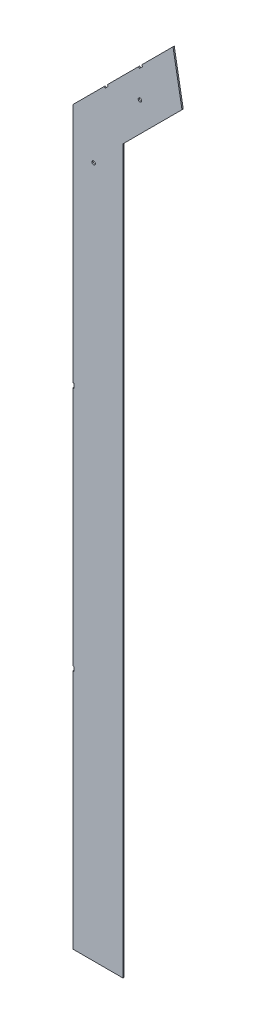
ISO-10303-21;
HEADER;
FILE_DESCRIPTION(('STEP AP214'),'2;1');
FILE_NAME('part.step','',(''),(''),'','','');
FILE_SCHEMA(('AUTOMOTIVE_DESIGN { 1 0 10303 214 1 1 1 1 }'));
ENDSEC;
DATA;
#1=APPLICATION_CONTEXT('core data for automotive mechanical design processes');
#2=APPLICATION_PROTOCOL_DEFINITION('international standard','automotive_design',2000,#1);
#3=PRODUCT_CONTEXT('',#1,'mechanical');
#4=PRODUCT('Part','Part','',(#3));
#5=PRODUCT_RELATED_PRODUCT_CATEGORY('part','',(#4));
#6=PRODUCT_DEFINITION_FORMATION('','',#4);
#7=PRODUCT_DEFINITION_CONTEXT('part definition',#1,'design');
#8=PRODUCT_DEFINITION('design','',#6,#7);
#9=PRODUCT_DEFINITION_SHAPE('','',#8);
#10=(LENGTH_UNIT() NAMED_UNIT(*) SI_UNIT(.MILLI.,.METRE.));
#11=(NAMED_UNIT(*) PLANE_ANGLE_UNIT() SI_UNIT($,.RADIAN.));
#12=(NAMED_UNIT(*) SI_UNIT($,.STERADIAN.) SOLID_ANGLE_UNIT());
#13=UNCERTAINTY_MEASURE_WITH_UNIT(LENGTH_MEASURE(1.E-05),#10,'distance_accuracy_value','');
#14=(GEOMETRIC_REPRESENTATION_CONTEXT(3) GLOBAL_UNCERTAINTY_ASSIGNED_CONTEXT((#13)) GLOBAL_UNIT_ASSIGNED_CONTEXT((#10,
#11,#12)) REPRESENTATION_CONTEXT('',''));
#15=CARTESIAN_POINT('',(0.,0.,0.));
#16=DIRECTION('',(0.,0.,1.));
#17=DIRECTION('',(1.,0.,0.));
#18=AXIS2_PLACEMENT_3D('',#15,#16,#17);
#19=CARTESIAN_POINT('',(0.,0.,0.));
#20=DIRECTION('',(0.,0.,1.));
#21=DIRECTION('',(1.,0.,0.));
#22=AXIS2_PLACEMENT_3D('',#19,#20,#21);
#23=PLANE('',#22);
#24=CARTESIAN_POINT('',(-559.25,332.,0.));
#25=DIRECTION('',(0.,0.,-1.));
#26=DIRECTION('',(-1.,0.,0.));
#27=AXIS2_PLACEMENT_3D('',#24,#25,#26);
#28=CIRCLE('',#27,2.09999999999999);
#29=CARTESIAN_POINT('',(-561.35,332.,0.));
#30=VERTEX_POINT('',#29);
#31=EDGE_CURVE('E337',#30,#30,#28,.T.);
#32=ORIENTED_EDGE('',*,*,#31,.F.);
#33=EDGE_LOOP('',(#32));
#34=FACE_BOUND('',#33,.T.);
#35=CARTESIAN_POINT('',(-503.894660940672,425.000000000001,0.));
#36=DIRECTION('',(0.,0.,-1.));
#37=DIRECTION('',(-1.,0.,0.));
#38=AXIS2_PLACEMENT_3D('',#35,#36,#37);
#39=CIRCLE('',#38,2.09999999999999);
#40=CARTESIAN_POINT('',(-505.994660940672,425.000000000001,0.));
#41=VERTEX_POINT('',#40);
#42=EDGE_CURVE('E441',#41,#41,#39,.T.);
#43=ORIENTED_EDGE('',*,*,#42,.F.);
#44=EDGE_LOOP('',(#43));
#45=FACE_BOUND('',#44,.T.);
#46=DIRECTION('',(0.707106781186546,-0.707106781186549,0.));
#47=VECTOR('',#46,1.);
#48=CARTESIAN_POINT('',(-546.88986531643,417.642977396045,0.));
#49=LINE('',#48,#47);
#50=CARTESIAN_POINT('',(-546.748443960193,417.501556039808,0.));
#51=VERTEX_POINT('',#50);
#52=CARTESIAN_POINT('',(-545.546362432176,416.299474511791,0.));
#53=VERTEX_POINT('',#52);
#54=EDGE_CURVE('E259',#51,#53,#49,.T.);
#55=ORIENTED_EDGE('',*,*,#54,.T.);
#56=DIRECTION('',(-0.707106781186553,-0.707106781186542,0.));
#57=VECTOR('',#56,1.);
#58=CARTESIAN_POINT('',(-545.546362432176,416.299474511791,0.));
#59=LINE('',#58,#57);
#60=CARTESIAN_POINT('',(-541.727985813768,420.117851130198,0.));
#61=VERTEX_POINT('',#60);
#62=EDGE_CURVE('E248',#61,#53,#59,.T.);
#63=ORIENTED_EDGE('',*,*,#62,.F.);
#64=DIRECTION('',(0.707106781186546,-0.707106781186549,0.));
#65=VECTOR('',#64,1.);
#66=CARTESIAN_POINT('',(-543.071488698023,421.461354014453,0.));
#67=LINE('',#66,#65);
#68=CARTESIAN_POINT('',(-542.930067341785,421.319932658215,0.));
#69=VERTEX_POINT('',#68);
#70=EDGE_CURVE('E261',#69,#61,#67,.T.);
#71=ORIENTED_EDGE('',*,*,#70,.F.);
#72=DIRECTION('',(0.707106781186549,0.707106781186546,0.));
#73=VECTOR('',#72,1.);
#74=CARTESIAN_POINT('',(-584.25,380.,0.));
#75=LINE('',#74,#73);
#76=CARTESIAN_POINT('',(-505.569932658215,458.680067341785,0.));
#77=VERTEX_POINT('',#76);
#78=EDGE_CURVE('E347',#69,#77,#75,.T.);
#79=ORIENTED_EDGE('',*,*,#78,.T.);
#80=DIRECTION('',(0.707106781186546,-0.707106781186549,0.));
#81=VECTOR('',#80,1.);
#82=CARTESIAN_POINT('',(-505.711354014452,458.821488698023,0.));
#83=LINE('',#82,#81);
#84=CARTESIAN_POINT('',(-504.367851130198,457.477985813768,0.));
#85=VERTEX_POINT('',#84);
#86=EDGE_CURVE('E276',#77,#85,#83,.T.);
#87=ORIENTED_EDGE('',*,*,#86,.T.);
#88=DIRECTION('',(-0.707106781186548,-0.707106781186548,0.));
#89=VECTOR('',#88,1.);
#90=CARTESIAN_POINT('',(-504.367851130198,457.477985813768,0.));
#91=LINE('',#90,#89);
#92=CARTESIAN_POINT('',(-500.549474511791,461.296362432176,0.));
#93=VERTEX_POINT('',#92);
#94=EDGE_CURVE('E273',#93,#85,#91,.T.);
#95=ORIENTED_EDGE('',*,*,#94,.F.);
#96=DIRECTION('',(0.707106781186546,-0.707106781186549,0.));
#97=VECTOR('',#96,1.);
#98=CARTESIAN_POINT('',(-501.892977396045,462.63986531643,0.));
#99=LINE('',#98,#97);
#100=CARTESIAN_POINT('',(-501.751556039808,462.498443960193,0.));
#101=VERTEX_POINT('',#100);
#102=EDGE_CURVE('E279',#101,#93,#99,.T.);
#103=ORIENTED_EDGE('',*,*,#102,.F.);
#104=CARTESIAN_POINT('',(-464.25,500.,0.));
#105=VERTEX_POINT('',#104);
#106=EDGE_CURVE('E325',#101,#105,#75,.T.);
#107=ORIENTED_EDGE('',*,*,#106,.T.);
#108=DIRECTION('',(0.17573327643003,-0.984437817007843,0.));
#109=VECTOR('',#108,1.);
#110=CARTESIAN_POINT('',(-363.413704359279,-64.8734535216678,0.));
#111=LINE('',#110,#109);
#112=CARTESIAN_POINT('',(-453.539321881346,440.,0.));
#113=VERTEX_POINT('',#112);
#114=EDGE_CURVE('E331',#105,#113,#111,.T.);
#115=ORIENTED_EDGE('',*,*,#114,.T.);
#116=DIRECTION('',(0.707106781186547,0.707106781186547,0.));
#117=VECTOR('',#116,1.);
#118=CARTESIAN_POINT('',(-524.25,369.289321881346,0.));
#119=LINE('',#118,#117);
#120=CARTESIAN_POINT('',(-524.25,369.289321881346,0.));
#121=VERTEX_POINT('',#120);
#122=EDGE_CURVE('E435',#121,#113,#119,.T.);
#123=ORIENTED_EDGE('',*,*,#122,.F.);
#124=DIRECTION('',(0.,1.,0.));
#125=VECTOR('',#124,1.);
#126=CARTESIAN_POINT('',(-524.25,0.,0.));
#127=LINE('',#126,#125);
#128=CARTESIAN_POINT('',(-524.25,-495.5,0.));
#129=VERTEX_POINT('',#128);
#130=EDGE_CURVE('E436',#129,#121,#127,.T.);
#131=ORIENTED_EDGE('',*,*,#130,.F.);
#132=DIRECTION('',(-1.,0.,0.));
#133=VECTOR('',#132,1.);
#134=CARTESIAN_POINT('',(0.,-495.5,0.));
#135=LINE('',#134,#133);
#136=CARTESIAN_POINT('',(-584.25,-495.5,0.));
#137=VERTEX_POINT('',#136);
#138=EDGE_CURVE('E323',#129,#137,#135,.T.);
#139=ORIENTED_EDGE('',*,*,#138,.T.);
#140=DIRECTION('',(0.,1.,0.));
#141=VECTOR('',#140,1.);
#142=CARTESIAN_POINT('',(-584.25,500.,0.));
#143=LINE('',#142,#141);
#144=CARTESIAN_POINT('',(-584.25,-207.2,0.));
#145=VERTEX_POINT('',#144);
#146=EDGE_CURVE('E327',#137,#145,#143,.T.);
#147=ORIENTED_EDGE('',*,*,#146,.T.);
#148=DIRECTION('',(1.,0.,0.));
#149=VECTOR('',#148,1.);
#150=CARTESIAN_POINT('',(-584.45,-207.2,0.));
#151=LINE('',#150,#149);
#152=CARTESIAN_POINT('',(-582.55,-207.2,0.));
#153=VERTEX_POINT('',#152);
#154=EDGE_CURVE('E295',#145,#153,#151,.T.);
#155=ORIENTED_EDGE('',*,*,#154,.T.);
#156=DIRECTION('',(0.,-1.,0.));
#157=VECTOR('',#156,1.);
#158=CARTESIAN_POINT('',(-582.55,-207.2,0.));
#159=LINE('',#158,#157);
#160=CARTESIAN_POINT('',(-582.55,-201.8,0.));
#161=VERTEX_POINT('',#160);
#162=EDGE_CURVE('E292',#161,#153,#159,.T.);
#163=ORIENTED_EDGE('',*,*,#162,.F.);
#164=DIRECTION('',(1.,0.,0.));
#165=VECTOR('',#164,1.);
#166=CARTESIAN_POINT('',(-584.45,-201.8,0.));
#167=LINE('',#166,#165);
#168=CARTESIAN_POINT('',(-584.25,-201.8,0.));
#169=VERTEX_POINT('',#168);
#170=EDGE_CURVE('E298',#169,#161,#167,.T.);
#171=ORIENTED_EDGE('',*,*,#170,.F.);
#172=CARTESIAN_POINT('',(-584.25,86.3000000000004,0.));
#173=VERTEX_POINT('',#172);
#174=EDGE_CURVE('E332',#169,#173,#143,.T.);
#175=ORIENTED_EDGE('',*,*,#174,.T.);
#176=DIRECTION('',(1.,0.,0.));
#177=VECTOR('',#176,1.);
#178=CARTESIAN_POINT('',(-584.45,86.3000000000004,0.));
#179=LINE('',#178,#177);
#180=CARTESIAN_POINT('',(-582.55,86.3000000000004,0.));
#181=VERTEX_POINT('',#180);
#182=EDGE_CURVE('E311',#173,#181,#179,.T.);
#183=ORIENTED_EDGE('',*,*,#182,.T.);
#184=DIRECTION('',(0.,-1.,0.));
#185=VECTOR('',#184,1.);
#186=CARTESIAN_POINT('',(-582.55,86.3000000000004,0.));
#187=LINE('',#186,#185);
#188=CARTESIAN_POINT('',(-582.55,91.7000000000004,0.));
#189=VERTEX_POINT('',#188);
#190=EDGE_CURVE('E308',#189,#181,#187,.T.);
#191=ORIENTED_EDGE('',*,*,#190,.F.);
#192=DIRECTION('',(1.,0.,0.));
#193=VECTOR('',#192,1.);
#194=CARTESIAN_POINT('',(-584.45,91.7000000000004,0.));
#195=LINE('',#194,#193);
#196=CARTESIAN_POINT('',(-584.25,91.7000000000004,0.));
#197=VERTEX_POINT('',#196);
#198=EDGE_CURVE('E286',#197,#189,#195,.T.);
#199=ORIENTED_EDGE('',*,*,#198,.F.);
#200=CARTESIAN_POINT('',(-584.25,380.,0.));
#201=VERTEX_POINT('',#200);
#202=EDGE_CURVE('E334',#197,#201,#143,.T.);
#203=ORIENTED_EDGE('',*,*,#202,.T.);
#204=EDGE_CURVE('E350',#201,#51,#75,.T.);
#205=ORIENTED_EDGE('',*,*,#204,.T.);
#206=EDGE_LOOP('',(#55,#63,#71,#79,#87,#95,#103,#107,#115,#123,#131,#139,#147,#155,#163,#171,
#175,#183,#191,#199,#203,#205));
#207=FACE_BOUND('',#206,.T.);
#208=ADVANCED_FACE('F42',(#34,#45,#207),#23,.F.);
#209=CARTESIAN_POINT('',(265.75,440.,1.5));
#210=DIRECTION('',(0.,0.,1.));
#211=DIRECTION('',(1.,0.,0.));
#212=AXIS2_PLACEMENT_3D('',#209,#210,#211);
#213=PLANE('',#212);
#214=CARTESIAN_POINT('',(-559.25,332.,1.5));
#215=DIRECTION('',(0.,0.,-1.));
#216=DIRECTION('',(-1.,0.,0.));
#217=AXIS2_PLACEMENT_3D('',#214,#215,#216);
#218=CIRCLE('',#217,2.09999999999999);
#219=CARTESIAN_POINT('',(-561.35,332.,1.5));
#220=VERTEX_POINT('',#219);
#221=EDGE_CURVE('E452',#220,#220,#218,.T.);
#222=ORIENTED_EDGE('',*,*,#221,.T.);
#223=EDGE_LOOP('',(#222));
#224=FACE_BOUND('',#223,.T.);
#225=CARTESIAN_POINT('',(-503.894660940672,425.000000000001,1.5));
#226=DIRECTION('',(0.,0.,-1.));
#227=DIRECTION('',(-1.,0.,0.));
#228=AXIS2_PLACEMENT_3D('',#225,#226,#227);
#229=CIRCLE('',#228,2.09999999999999);
#230=CARTESIAN_POINT('',(-505.994660940672,425.000000000001,1.5));
#231=VERTEX_POINT('',#230);
#232=EDGE_CURVE('E383',#231,#231,#229,.T.);
#233=ORIENTED_EDGE('',*,*,#232,.T.);
#234=EDGE_LOOP('',(#233));
#235=FACE_BOUND('',#234,.T.);
#236=DIRECTION('',(0.707106781186553,0.707106781186542,0.));
#237=VECTOR('',#236,1.);
#238=CARTESIAN_POINT('',(-545.546362432176,416.299474511791,1.5));
#239=LINE('',#238,#237);
#240=CARTESIAN_POINT('',(-545.546362432176,416.299474511791,1.5));
#241=VERTEX_POINT('',#240);
#242=CARTESIAN_POINT('',(-541.727985813768,420.117851130198,1.5));
#243=VERTEX_POINT('',#242);
#244=EDGE_CURVE('E246',#241,#243,#239,.T.);
#245=ORIENTED_EDGE('',*,*,#244,.F.);
#246=DIRECTION('',(0.707106781186546,-0.707106781186549,0.));
#247=VECTOR('',#246,1.);
#248=CARTESIAN_POINT('',(-546.88986531643,417.642977396045,1.5));
#249=LINE('',#248,#247);
#250=CARTESIAN_POINT('',(-546.748443960193,417.501556039808,1.5));
#251=VERTEX_POINT('',#250);
#252=EDGE_CURVE('E231',#251,#241,#249,.T.);
#253=ORIENTED_EDGE('',*,*,#252,.F.);
#254=DIRECTION('',(-0.707106781186549,-0.707106781186546,0.));
#255=VECTOR('',#254,1.);
#256=CARTESIAN_POINT('',(-584.25,380.,1.5));
#257=LINE('',#256,#255);
#258=CARTESIAN_POINT('',(-584.25,380.000000000001,1.5));
#259=VERTEX_POINT('',#258);
#260=EDGE_CURVE('E424',#251,#259,#257,.T.);
#261=ORIENTED_EDGE('',*,*,#260,.T.);
#262=DIRECTION('',(0.,-1.,0.));
#263=VECTOR('',#262,1.);
#264=CARTESIAN_POINT('',(-584.25,500.,1.5));
#265=LINE('',#264,#263);
#266=CARTESIAN_POINT('',(-584.25,91.7000000000004,1.5));
#267=VERTEX_POINT('',#266);
#268=EDGE_CURVE('E421',#259,#267,#265,.T.);
#269=ORIENTED_EDGE('',*,*,#268,.T.);
#270=DIRECTION('',(1.,0.,0.));
#271=VECTOR('',#270,1.);
#272=CARTESIAN_POINT('',(265.75,91.7000000000006,1.5));
#273=LINE('',#272,#271);
#274=CARTESIAN_POINT('',(-582.55,91.7000000000004,1.5));
#275=VERTEX_POINT('',#274);
#276=EDGE_CURVE('E398',#267,#275,#273,.T.);
#277=ORIENTED_EDGE('',*,*,#276,.T.);
#278=DIRECTION('',(0.,1.,0.));
#279=VECTOR('',#278,1.);
#280=CARTESIAN_POINT('',(-582.55,86.3000000000004,1.5));
#281=LINE('',#280,#279);
#282=CARTESIAN_POINT('',(-582.55,86.3000000000004,1.5));
#283=VERTEX_POINT('',#282);
#284=EDGE_CURVE('E302',#283,#275,#281,.T.);
#285=ORIENTED_EDGE('',*,*,#284,.F.);
#286=DIRECTION('',(-1.,0.,0.));
#287=VECTOR('',#286,1.);
#288=CARTESIAN_POINT('',(265.75,86.3000000000006,1.5));
#289=LINE('',#288,#287);
#290=CARTESIAN_POINT('',(-584.25,86.3000000000004,1.5));
#291=VERTEX_POINT('',#290);
#292=EDGE_CURVE('E401',#283,#291,#289,.T.);
#293=ORIENTED_EDGE('',*,*,#292,.T.);
#294=CARTESIAN_POINT('',(-584.25,-201.8,1.5));
#295=VERTEX_POINT('',#294);
#296=EDGE_CURVE('E419',#291,#295,#265,.T.);
#297=ORIENTED_EDGE('',*,*,#296,.T.);
#298=DIRECTION('',(1.,0.,0.));
#299=VECTOR('',#298,1.);
#300=CARTESIAN_POINT('',(265.75,-201.799999999999,1.5));
#301=LINE('',#300,#299);
#302=CARTESIAN_POINT('',(-582.55,-201.8,1.5));
#303=VERTEX_POINT('',#302);
#304=EDGE_CURVE('E403',#295,#303,#301,.T.);
#305=ORIENTED_EDGE('',*,*,#304,.T.);
#306=DIRECTION('',(0.,1.,0.));
#307=VECTOR('',#306,1.);
#308=CARTESIAN_POINT('',(-582.55,-207.2,1.5));
#309=LINE('',#308,#307);
#310=CARTESIAN_POINT('',(-582.55,-207.2,1.5));
#311=VERTEX_POINT('',#310);
#312=EDGE_CURVE('E285',#311,#303,#309,.T.);
#313=ORIENTED_EDGE('',*,*,#312,.F.);
#314=DIRECTION('',(-1.,0.,0.));
#315=VECTOR('',#314,1.);
#316=CARTESIAN_POINT('',(265.75,-207.2,1.5));
#317=LINE('',#316,#315);
#318=CARTESIAN_POINT('',(-584.25,-207.2,1.5));
#319=VERTEX_POINT('',#318);
#320=EDGE_CURVE('E345',#311,#319,#317,.T.);
#321=ORIENTED_EDGE('',*,*,#320,.T.);
#322=CARTESIAN_POINT('',(-584.25,-495.5,1.5));
#323=VERTEX_POINT('',#322);
#324=EDGE_CURVE('E322',#319,#323,#265,.T.);
#325=ORIENTED_EDGE('',*,*,#324,.T.);
#326=DIRECTION('',(1.,0.,0.));
#327=VECTOR('',#326,1.);
#328=CARTESIAN_POINT('',(554.25,-495.5,1.5));
#329=LINE('',#328,#327);
#330=CARTESIAN_POINT('',(-524.25,-495.5,1.5));
#331=VERTEX_POINT('',#330);
#332=EDGE_CURVE('E449',#323,#331,#329,.T.);
#333=ORIENTED_EDGE('',*,*,#332,.T.);
#334=DIRECTION('',(0.,1.,0.));
#335=VECTOR('',#334,1.);
#336=CARTESIAN_POINT('',(-524.25,-480.,1.5));
#337=LINE('',#336,#335);
#338=CARTESIAN_POINT('',(-524.25,369.289321881346,1.5));
#339=VERTEX_POINT('',#338);
#340=EDGE_CURVE('E389',#331,#339,#337,.T.);
#341=ORIENTED_EDGE('',*,*,#340,.T.);
#342=DIRECTION('',(-0.707106781186548,-0.707106781186548,0.));
#343=VECTOR('',#342,1.);
#344=CARTESIAN_POINT('',(-524.25,369.289321881346,1.5));
#345=LINE('',#344,#343);
#346=CARTESIAN_POINT('',(-453.539321881346,440.,1.5));
#347=VERTEX_POINT('',#346);
#348=EDGE_CURVE('E429',#339,#347,#345,.F.);
#349=ORIENTED_EDGE('',*,*,#348,.T.);
#350=DIRECTION('',(0.17573327643003,-0.984437817007843,0.));
#351=VECTOR('',#350,1.);
#352=CARTESIAN_POINT('',(-431.326096373807,315.564038458867,1.5));
#353=LINE('',#352,#351);
#354=CARTESIAN_POINT('',(-464.25,500.,1.5));
#355=VERTEX_POINT('',#354);
#356=EDGE_CURVE('E395',#355,#347,#353,.T.);
#357=ORIENTED_EDGE('',*,*,#356,.F.);
#358=CARTESIAN_POINT('',(-501.751556039808,462.498443960193,1.5));
#359=VERTEX_POINT('',#358);
#360=EDGE_CURVE('E425',#355,#359,#257,.T.);
#361=ORIENTED_EDGE('',*,*,#360,.T.);
#362=DIRECTION('',(0.707106781186546,-0.707106781186549,0.));
#363=VECTOR('',#362,1.);
#364=CARTESIAN_POINT('',(-501.892977396045,462.63986531643,1.5));
#365=LINE('',#364,#363);
#366=CARTESIAN_POINT('',(-500.549474511791,461.296362432176,1.5));
#367=VERTEX_POINT('',#366);
#368=EDGE_CURVE('E73',#359,#367,#365,.T.);
#369=ORIENTED_EDGE('',*,*,#368,.T.);
#370=DIRECTION('',(0.707106781186548,0.707106781186548,0.));
#371=VECTOR('',#370,1.);
#372=CARTESIAN_POINT('',(-504.367851130198,457.477985813768,1.5));
#373=LINE('',#372,#371);
#374=CARTESIAN_POINT('',(-504.367851130198,457.477985813768,1.5));
#375=VERTEX_POINT('',#374);
#376=EDGE_CURVE('E267',#375,#367,#373,.T.);
#377=ORIENTED_EDGE('',*,*,#376,.F.);
#378=DIRECTION('',(0.707106781186546,-0.707106781186549,0.));
#379=VECTOR('',#378,1.);
#380=CARTESIAN_POINT('',(-505.711354014452,458.821488698023,1.5));
#381=LINE('',#380,#379);
#382=CARTESIAN_POINT('',(-505.569932658215,458.680067341785,1.5));
#383=VERTEX_POINT('',#382);
#384=EDGE_CURVE('E250',#383,#375,#381,.T.);
#385=ORIENTED_EDGE('',*,*,#384,.F.);
#386=CARTESIAN_POINT('',(-542.930067341785,421.319932658215,1.5));
#387=VERTEX_POINT('',#386);
#388=EDGE_CURVE('E362',#383,#387,#257,.T.);
#389=ORIENTED_EDGE('',*,*,#388,.T.);
#390=DIRECTION('',(0.707106781186546,-0.707106781186549,0.));
#391=VECTOR('',#390,1.);
#392=CARTESIAN_POINT('',(-543.071488698023,421.461354014453,1.5));
#393=LINE('',#392,#391);
#394=EDGE_CURVE('E61',#387,#243,#393,.T.);
#395=ORIENTED_EDGE('',*,*,#394,.T.);
#396=EDGE_LOOP('',(#245,#253,#261,#269,#277,#285,#293,#297,#305,#313,#321,#325,#333,#341,#349,
#357,#361,#369,#377,#385,#389,#395));
#397=FACE_BOUND('',#396,.T.);
#398=ADVANCED_FACE('F252',(#224,#235,#397),#213,.T.);
#399=CARTESIAN_POINT('',(-584.25,380.,50.));
#400=DIRECTION('',(0.707106781186546,-0.707106781186549,0.));
#401=DIRECTION('',(0.707106781186549,0.707106781186546,0.));
#402=AXIS2_PLACEMENT_3D('',#399,#400,#401);
#403=PLANE('',#402);
#404=DIRECTION('',(0.,0.,1.));
#405=VECTOR('',#404,1.);
#406=CARTESIAN_POINT('',(-546.748443960193,417.501556039808,50.));
#407=LINE('',#406,#405);
#408=EDGE_CURVE('E11',#51,#251,#407,.T.);
#409=ORIENTED_EDGE('',*,*,#408,.F.);
#410=ORIENTED_EDGE('',*,*,#204,.F.);
#411=DIRECTION('',(0.,0.,1.));
#412=VECTOR('',#411,1.);
#413=CARTESIAN_POINT('',(-584.25,380.000000000001,50.));
#414=LINE('',#413,#412);
#415=EDGE_CURVE('E380',#201,#259,#414,.T.);
#416=ORIENTED_EDGE('',*,*,#415,.T.);
#417=ORIENTED_EDGE('',*,*,#260,.F.);
#418=EDGE_LOOP('',(#409,#410,#416,#417));
#419=FACE_BOUND('',#418,.T.);
#420=ADVANCED_FACE('F508',(#419),#403,.F.);
#421=DIRECTION('',(0.,0.,-1.));
#422=VECTOR('',#421,1.);
#423=CARTESIAN_POINT('',(-542.930067341785,421.319932658215,50.));
#424=LINE('',#423,#422);
#425=EDGE_CURVE('E50',#387,#69,#424,.T.);
#426=ORIENTED_EDGE('',*,*,#425,.F.);
#427=ORIENTED_EDGE('',*,*,#388,.F.);
#428=DIRECTION('',(0.,0.,1.));
#429=VECTOR('',#428,1.);
#430=CARTESIAN_POINT('',(-505.569932658215,458.680067341785,50.));
#431=LINE('',#430,#429);
#432=EDGE_CURVE('E353',#77,#383,#431,.T.);
#433=ORIENTED_EDGE('',*,*,#432,.F.);
#434=ORIENTED_EDGE('',*,*,#78,.F.);
#435=EDGE_LOOP('',(#426,#427,#433,#434));
#436=FACE_BOUND('',#435,.T.);
#437=ADVANCED_FACE('F361',(#436),#403,.F.);
#438=DIRECTION('',(0.,0.,-1.));
#439=VECTOR('',#438,1.);
#440=CARTESIAN_POINT('',(-501.751556039808,462.498443960193,50.));
#441=LINE('',#440,#439);
#442=EDGE_CURVE('E351',#359,#101,#441,.T.);
#443=ORIENTED_EDGE('',*,*,#442,.F.);
#444=ORIENTED_EDGE('',*,*,#360,.F.);
#445=DIRECTION('',(0.,0.,1.));
#446=VECTOR('',#445,1.);
#447=CARTESIAN_POINT('',(-464.25,500.,50.));
#448=LINE('',#447,#446);
#449=EDGE_CURVE('E377',#105,#355,#448,.T.);
#450=ORIENTED_EDGE('',*,*,#449,.F.);
#451=ORIENTED_EDGE('',*,*,#106,.F.);
#452=EDGE_LOOP('',(#443,#444,#450,#451));
#453=FACE_BOUND('',#452,.T.);
#454=ADVANCED_FACE('F375',(#453),#403,.F.);
#455=CARTESIAN_POINT('',(-584.25,500.,50.));
#456=DIRECTION('',(1.,0.,0.));
#457=DIRECTION('',(0.,1.,0.));
#458=AXIS2_PLACEMENT_3D('',#455,#456,#457);
#459=PLANE('',#458);
#460=DIRECTION('',(0.,0.,1.));
#461=VECTOR('',#460,1.);
#462=CARTESIAN_POINT('',(-584.25,-207.2,50.));
#463=LINE('',#462,#461);
#464=EDGE_CURVE('E320',#145,#319,#463,.T.);
#465=ORIENTED_EDGE('',*,*,#464,.F.);
#466=ORIENTED_EDGE('',*,*,#146,.F.);
#467=DIRECTION('',(0.,0.,1.));
#468=VECTOR('',#467,1.);
#469=CARTESIAN_POINT('',(-584.25,-495.5,50.));
#470=LINE('',#469,#468);
#471=EDGE_CURVE('E326',#137,#323,#470,.T.);
#472=ORIENTED_EDGE('',*,*,#471,.T.);
#473=ORIENTED_EDGE('',*,*,#324,.F.);
#474=EDGE_LOOP('',(#465,#466,#472,#473));
#475=FACE_BOUND('',#474,.T.);
#476=ADVANCED_FACE('F416',(#475),#459,.F.);
#477=DIRECTION('',(0.,0.,-1.));
#478=VECTOR('',#477,1.);
#479=CARTESIAN_POINT('',(-584.25,-201.8,50.));
#480=LINE('',#479,#478);
#481=EDGE_CURVE('E318',#295,#169,#480,.T.);
#482=ORIENTED_EDGE('',*,*,#481,.F.);
#483=ORIENTED_EDGE('',*,*,#296,.F.);
#484=DIRECTION('',(0.,0.,1.));
#485=VECTOR('',#484,1.);
#486=CARTESIAN_POINT('',(-584.25,86.3000000000004,50.));
#487=LINE('',#486,#485);
#488=EDGE_CURVE('E316',#173,#291,#487,.T.);
#489=ORIENTED_EDGE('',*,*,#488,.F.);
#490=ORIENTED_EDGE('',*,*,#174,.F.);
#491=EDGE_LOOP('',(#482,#483,#489,#490));
#492=FACE_BOUND('',#491,.T.);
#493=ADVANCED_FACE('F477',(#492),#459,.F.);
#494=DIRECTION('',(0.,0.,-1.));
#495=VECTOR('',#494,1.);
#496=CARTESIAN_POINT('',(-584.25,91.7000000000004,50.));
#497=LINE('',#496,#495);
#498=EDGE_CURVE('E300',#267,#197,#497,.T.);
#499=ORIENTED_EDGE('',*,*,#498,.F.);
#500=ORIENTED_EDGE('',*,*,#268,.F.);
#501=ORIENTED_EDGE('',*,*,#415,.F.);
#502=ORIENTED_EDGE('',*,*,#202,.F.);
#503=EDGE_LOOP('',(#499,#500,#501,#502));
#504=FACE_BOUND('',#503,.T.);
#505=ADVANCED_FACE('F491',(#504),#459,.F.);
#506=CARTESIAN_POINT('',(-453.539321881346,440.,1.51010307764118));
#507=DIRECTION('',(-0.984437817007843,-0.17573327643003,0.));
#508=DIRECTION('',(0.17573327643003,-0.984437817007843,0.));
#509=AXIS2_PLACEMENT_3D('',#506,#507,#508);
#510=PLANE('',#509);
#511=ORIENTED_EDGE('',*,*,#356,.T.);
#512=DIRECTION('',(0.,0.,1.));
#513=VECTOR('',#512,1.);
#514=CARTESIAN_POINT('',(-453.539321881346,440.,1.5));
#515=LINE('',#514,#513);
#516=EDGE_CURVE('E338',#113,#347,#515,.T.);
#517=ORIENTED_EDGE('',*,*,#516,.F.);
#518=ORIENTED_EDGE('',*,*,#114,.F.);
#519=ORIENTED_EDGE('',*,*,#449,.T.);
#520=EDGE_LOOP('',(#511,#517,#518,#519));
#521=FACE_BOUND('',#520,.T.);
#522=ADVANCED_FACE('F44',(#521),#510,.F.);
#523=CARTESIAN_POINT('',(-503.894660940672,425.000000000001,0.));
#524=DIRECTION('',(0.,0.,-1.));
#525=DIRECTION('',(-1.,0.,0.));
#526=AXIS2_PLACEMENT_3D('',#523,#524,#525);
#527=CYLINDRICAL_SURFACE('',#526,2.09999999999999);
#528=ORIENTED_EDGE('',*,*,#232,.F.);
#529=EDGE_LOOP('',(#528));
#530=FACE_BOUND('',#529,.T.);
#531=ORIENTED_EDGE('',*,*,#42,.T.);
#532=EDGE_LOOP('',(#531));
#533=FACE_BOUND('',#532,.T.);
#534=ADVANCED_FACE('F501',(#530,#533),#527,.F.);
#535=CARTESIAN_POINT('',(335.75,-495.5,1.5));
#536=DIRECTION('',(0.,1.,0.));
#537=DIRECTION('',(0.,0.,1.));
#538=AXIS2_PLACEMENT_3D('',#535,#536,#537);
#539=PLANE('',#538);
#540=ORIENTED_EDGE('',*,*,#332,.F.);
#541=ORIENTED_EDGE('',*,*,#471,.F.);
#542=ORIENTED_EDGE('',*,*,#138,.F.);
#543=DIRECTION('',(0.,0.,-1.));
#544=VECTOR('',#543,1.);
#545=CARTESIAN_POINT('',(-524.25,-495.5,3.));
#546=LINE('',#545,#544);
#547=EDGE_CURVE('E447',#331,#129,#546,.T.);
#548=ORIENTED_EDGE('',*,*,#547,.F.);
#549=EDGE_LOOP('',(#540,#541,#542,#548));
#550=FACE_BOUND('',#549,.T.);
#551=ADVANCED_FACE('F465',(#550),#539,.F.);
#552=CARTESIAN_POINT('',(-559.25,332.,0.));
#553=DIRECTION('',(0.,0.,-1.));
#554=DIRECTION('',(-1.,0.,0.));
#555=AXIS2_PLACEMENT_3D('',#552,#553,#554);
#556=CYLINDRICAL_SURFACE('',#555,2.09999999999999);
#557=ORIENTED_EDGE('',*,*,#221,.F.);
#558=EDGE_LOOP('',(#557));
#559=FACE_BOUND('',#558,.T.);
#560=ORIENTED_EDGE('',*,*,#31,.T.);
#561=EDGE_LOOP('',(#560));
#562=FACE_BOUND('',#561,.T.);
#563=ADVANCED_FACE('F513',(#559,#562),#556,.F.);
#564=CARTESIAN_POINT('',(-524.25,-480.,1.5));
#565=DIRECTION('',(-1.,0.,0.));
#566=DIRECTION('',(0.,0.,1.));
#567=AXIS2_PLACEMENT_3D('',#564,#565,#566);
#568=PLANE('',#567);
#569=DIRECTION('',(0.,0.,1.));
#570=VECTOR('',#569,1.);
#571=CARTESIAN_POINT('',(-524.25,369.289321881346,1.5));
#572=LINE('',#571,#570);
#573=EDGE_CURVE('E444',#121,#339,#572,.T.);
#574=ORIENTED_EDGE('',*,*,#573,.T.);
#575=ORIENTED_EDGE('',*,*,#340,.F.);
#576=ORIENTED_EDGE('',*,*,#547,.T.);
#577=ORIENTED_EDGE('',*,*,#130,.T.);
#578=EDGE_LOOP('',(#574,#575,#576,#577));
#579=FACE_BOUND('',#578,.T.);
#580=ADVANCED_FACE('F462',(#579),#568,.F.);
#581=CARTESIAN_POINT('',(-524.25,369.289321881346,1.5));
#582=DIRECTION('',(-0.707106781186548,0.707106781186548,0.));
#583=DIRECTION('',(-0.707106781186548,-0.707106781186548,0.));
#584=AXIS2_PLACEMENT_3D('',#581,#582,#583);
#585=PLANE('',#584);
#586=ORIENTED_EDGE('',*,*,#516,.T.);
#587=ORIENTED_EDGE('',*,*,#348,.F.);
#588=ORIENTED_EDGE('',*,*,#573,.F.);
#589=ORIENTED_EDGE('',*,*,#122,.T.);
#590=EDGE_LOOP('',(#586,#587,#588,#589));
#591=FACE_BOUND('',#590,.T.);
#592=ADVANCED_FACE('F459',(#591),#585,.F.);
#593=CARTESIAN_POINT('',(-584.45,86.3000000000004,1.5));
#594=DIRECTION('',(0.,1.,0.));
#595=DIRECTION('',(-1.,0.,0.));
#596=AXIS2_PLACEMENT_3D('',#593,#594,#595);
#597=PLANE('',#596);
#598=ORIENTED_EDGE('',*,*,#488,.T.);
#599=ORIENTED_EDGE('',*,*,#292,.F.);
#600=DIRECTION('',(0.,0.,1.));
#601=VECTOR('',#600,1.);
#602=CARTESIAN_POINT('',(-582.55,86.3000000000004,1.5));
#603=LINE('',#602,#601);
#604=EDGE_CURVE('E240',#181,#283,#603,.T.);
#605=ORIENTED_EDGE('',*,*,#604,.F.);
#606=ORIENTED_EDGE('',*,*,#182,.F.);
#607=EDGE_LOOP('',(#598,#599,#605,#606));
#608=FACE_BOUND('',#607,.T.);
#609=ADVANCED_FACE('F481',(#608),#597,.T.);
#610=CARTESIAN_POINT('',(-584.45,91.7000000000004,1.5));
#611=DIRECTION('',(0.,-1.,0.));
#612=DIRECTION('',(1.,0.,0.));
#613=AXIS2_PLACEMENT_3D('',#610,#611,#612);
#614=PLANE('',#613);
#615=ORIENTED_EDGE('',*,*,#498,.T.);
#616=ORIENTED_EDGE('',*,*,#198,.T.);
#617=DIRECTION('',(0.,0.,-1.));
#618=VECTOR('',#617,1.);
#619=CARTESIAN_POINT('',(-582.55,91.7000000000004,1.5));
#620=LINE('',#619,#618);
#621=EDGE_CURVE('E305',#275,#189,#620,.T.);
#622=ORIENTED_EDGE('',*,*,#621,.F.);
#623=ORIENTED_EDGE('',*,*,#276,.F.);
#624=EDGE_LOOP('',(#615,#616,#622,#623));
#625=FACE_BOUND('',#624,.T.);
#626=ADVANCED_FACE('F492',(#625),#614,.T.);
#627=CARTESIAN_POINT('',(-582.55,0.,0.));
#628=DIRECTION('',(1.,0.,0.));
#629=DIRECTION('',(0.,0.,-1.));
#630=AXIS2_PLACEMENT_3D('',#627,#628,#629);
#631=PLANE('',#630);
#632=ORIENTED_EDGE('',*,*,#604,.T.);
#633=ORIENTED_EDGE('',*,*,#284,.T.);
#634=ORIENTED_EDGE('',*,*,#621,.T.);
#635=ORIENTED_EDGE('',*,*,#190,.T.);
#636=EDGE_LOOP('',(#632,#633,#634,#635));
#637=FACE_BOUND('',#636,.T.);
#638=ADVANCED_FACE('F484',(#637),#631,.F.);
#639=CARTESIAN_POINT('',(-584.45,-207.2,1.5));
#640=DIRECTION('',(0.,1.,0.));
#641=DIRECTION('',(-1.,0.,0.));
#642=AXIS2_PLACEMENT_3D('',#639,#640,#641);
#643=PLANE('',#642);
#644=ORIENTED_EDGE('',*,*,#464,.T.);
#645=ORIENTED_EDGE('',*,*,#320,.F.);
#646=DIRECTION('',(0.,0.,1.));
#647=VECTOR('',#646,1.);
#648=CARTESIAN_POINT('',(-582.55,-207.2,1.5));
#649=LINE('',#648,#647);
#650=EDGE_CURVE('E283',#153,#311,#649,.T.);
#651=ORIENTED_EDGE('',*,*,#650,.F.);
#652=ORIENTED_EDGE('',*,*,#154,.F.);
#653=EDGE_LOOP('',(#644,#645,#651,#652));
#654=FACE_BOUND('',#653,.T.);
#655=ADVANCED_FACE('F468',(#654),#643,.T.);
#656=CARTESIAN_POINT('',(-584.45,-201.8,1.5));
#657=DIRECTION('',(0.,-1.,0.));
#658=DIRECTION('',(1.,0.,0.));
#659=AXIS2_PLACEMENT_3D('',#656,#657,#658);
#660=PLANE('',#659);
#661=ORIENTED_EDGE('',*,*,#481,.T.);
#662=ORIENTED_EDGE('',*,*,#170,.T.);
#663=DIRECTION('',(0.,0.,-1.));
#664=VECTOR('',#663,1.);
#665=CARTESIAN_POINT('',(-582.55,-201.8,1.5));
#666=LINE('',#665,#664);
#667=EDGE_CURVE('E289',#303,#161,#666,.T.);
#668=ORIENTED_EDGE('',*,*,#667,.F.);
#669=ORIENTED_EDGE('',*,*,#304,.F.);
#670=EDGE_LOOP('',(#661,#662,#668,#669));
#671=FACE_BOUND('',#670,.T.);
#672=ADVANCED_FACE('F472',(#671),#660,.T.);
#673=CARTESIAN_POINT('',(-582.55,0.,0.));
#674=DIRECTION('',(1.,0.,0.));
#675=DIRECTION('',(0.,0.,-1.));
#676=AXIS2_PLACEMENT_3D('',#673,#674,#675);
#677=PLANE('',#676);
#678=ORIENTED_EDGE('',*,*,#650,.T.);
#679=ORIENTED_EDGE('',*,*,#312,.T.);
#680=ORIENTED_EDGE('',*,*,#667,.T.);
#681=ORIENTED_EDGE('',*,*,#162,.T.);
#682=EDGE_LOOP('',(#678,#679,#680,#681));
#683=FACE_BOUND('',#682,.T.);
#684=ADVANCED_FACE('F470',(#683),#677,.F.);
#685=CARTESIAN_POINT('',(-505.711354014452,458.821488698023,1.5));
#686=DIRECTION('',(0.707106781186549,0.707106781186546,0.));
#687=DIRECTION('',(-0.707106781186546,0.707106781186549,0.));
#688=AXIS2_PLACEMENT_3D('',#685,#686,#687);
#689=PLANE('',#688);
#690=ORIENTED_EDGE('',*,*,#432,.T.);
#691=ORIENTED_EDGE('',*,*,#384,.T.);
#692=DIRECTION('',(0.,0.,1.));
#693=VECTOR('',#692,1.);
#694=CARTESIAN_POINT('',(-504.367851130198,457.477985813768,1.5));
#695=LINE('',#694,#693);
#696=EDGE_CURVE('E264',#85,#375,#695,.T.);
#697=ORIENTED_EDGE('',*,*,#696,.F.);
#698=ORIENTED_EDGE('',*,*,#86,.F.);
#699=EDGE_LOOP('',(#690,#691,#697,#698));
#700=FACE_BOUND('',#699,.T.);
#701=ADVANCED_FACE('F365',(#700),#689,.T.);
#702=CARTESIAN_POINT('',(-501.892977396045,462.63986531643,1.5));
#703=DIRECTION('',(-0.707106781186549,-0.707106781186546,0.));
#704=DIRECTION('',(0.707106781186546,-0.707106781186549,0.));
#705=AXIS2_PLACEMENT_3D('',#702,#703,#704);
#706=PLANE('',#705);
#707=ORIENTED_EDGE('',*,*,#442,.T.);
#708=ORIENTED_EDGE('',*,*,#102,.T.);
#709=DIRECTION('',(0.,0.,-1.));
#710=VECTOR('',#709,1.);
#711=CARTESIAN_POINT('',(-500.549474511791,461.296362432176,1.5));
#712=LINE('',#711,#710);
#713=EDGE_CURVE('E270',#367,#93,#712,.T.);
#714=ORIENTED_EDGE('',*,*,#713,.F.);
#715=ORIENTED_EDGE('',*,*,#368,.F.);
#716=EDGE_LOOP('',(#707,#708,#714,#715));
#717=FACE_BOUND('',#716,.T.);
#718=ADVANCED_FACE('F610',(#717),#706,.T.);
#719=CARTESIAN_POINT('',(-480.922918471983,480.922918471983,0.));
#720=DIRECTION('',(0.707106781186548,-0.707106781186548,0.));
#721=DIRECTION('',(0.707106781186548,0.707106781186548,0.));
#722=AXIS2_PLACEMENT_3D('',#719,#720,#721);
#723=PLANE('',#722);
#724=ORIENTED_EDGE('',*,*,#696,.T.);
#725=ORIENTED_EDGE('',*,*,#376,.T.);
#726=ORIENTED_EDGE('',*,*,#713,.T.);
#727=ORIENTED_EDGE('',*,*,#94,.T.);
#728=EDGE_LOOP('',(#724,#725,#726,#727));
#729=FACE_BOUND('',#728,.T.);
#730=ADVANCED_FACE('F369',(#729),#723,.F.);
#731=CARTESIAN_POINT('',(-546.88986531643,417.642977396045,1.5));
#732=DIRECTION('',(0.707106781186549,0.707106781186546,0.));
#733=DIRECTION('',(-0.707106781186546,0.707106781186549,0.));
#734=AXIS2_PLACEMENT_3D('',#731,#732,#733);
#735=PLANE('',#734);
#736=ORIENTED_EDGE('',*,*,#408,.T.);
#737=ORIENTED_EDGE('',*,*,#252,.T.);
#738=DIRECTION('',(0.,0.,1.));
#739=VECTOR('',#738,1.);
#740=CARTESIAN_POINT('',(-545.546362432176,416.299474511791,1.5));
#741=LINE('',#740,#739);
#742=EDGE_CURVE('E234',#53,#241,#741,.T.);
#743=ORIENTED_EDGE('',*,*,#742,.F.);
#744=ORIENTED_EDGE('',*,*,#54,.F.);
#745=EDGE_LOOP('',(#736,#737,#743,#744));
#746=FACE_BOUND('',#745,.T.);
#747=ADVANCED_FACE('F233',(#746),#735,.T.);
#748=CARTESIAN_POINT('',(-543.071488698023,421.461354014453,1.5));
#749=DIRECTION('',(-0.707106781186549,-0.707106781186546,0.));
#750=DIRECTION('',(0.707106781186546,-0.707106781186549,0.));
#751=AXIS2_PLACEMENT_3D('',#748,#749,#750);
#752=PLANE('',#751);
#753=ORIENTED_EDGE('',*,*,#425,.T.);
#754=ORIENTED_EDGE('',*,*,#70,.T.);
#755=DIRECTION('',(0.,0.,-1.));
#756=VECTOR('',#755,1.);
#757=CARTESIAN_POINT('',(-541.727985813768,420.117851130198,1.5));
#758=LINE('',#757,#756);
#759=EDGE_CURVE('E254',#243,#61,#758,.T.);
#760=ORIENTED_EDGE('',*,*,#759,.F.);
#761=ORIENTED_EDGE('',*,*,#394,.F.);
#762=EDGE_LOOP('',(#753,#754,#760,#761));
#763=FACE_BOUND('',#762,.T.);
#764=ADVANCED_FACE('F355',(#763),#752,.T.);
#765=CARTESIAN_POINT('',(-480.92291847198,480.922918471987,0.));
#766=DIRECTION('',(0.707106781186542,-0.707106781186553,0.));
#767=DIRECTION('',(0.707106781186553,0.707106781186542,0.));
#768=AXIS2_PLACEMENT_3D('',#765,#766,#767);
#769=PLANE('',#768);
#770=ORIENTED_EDGE('',*,*,#742,.T.);
#771=ORIENTED_EDGE('',*,*,#244,.T.);
#772=ORIENTED_EDGE('',*,*,#759,.T.);
#773=ORIENTED_EDGE('',*,*,#62,.T.);
#774=EDGE_LOOP('',(#770,#771,#772,#773));
#775=FACE_BOUND('',#774,.T.);
#776=ADVANCED_FACE('F244',(#775),#769,.F.);
#777=CLOSED_SHELL('',(#208,#398,#420,#437,#454,#476,#493,#505,#522,#534,#551,#563,#580,#592,
#609,#626,#638,#655,#672,#684,#701,#718,#730,#747,#764,#776));
#778=MANIFOLD_SOLID_BREP('B2',#777);
#779=ADVANCED_BREP_SHAPE_REPRESENTATION('',(#18,#778),#14);
#780=SHAPE_DEFINITION_REPRESENTATION(#9,#779);
ENDSEC;
END-ISO-10303-21;
